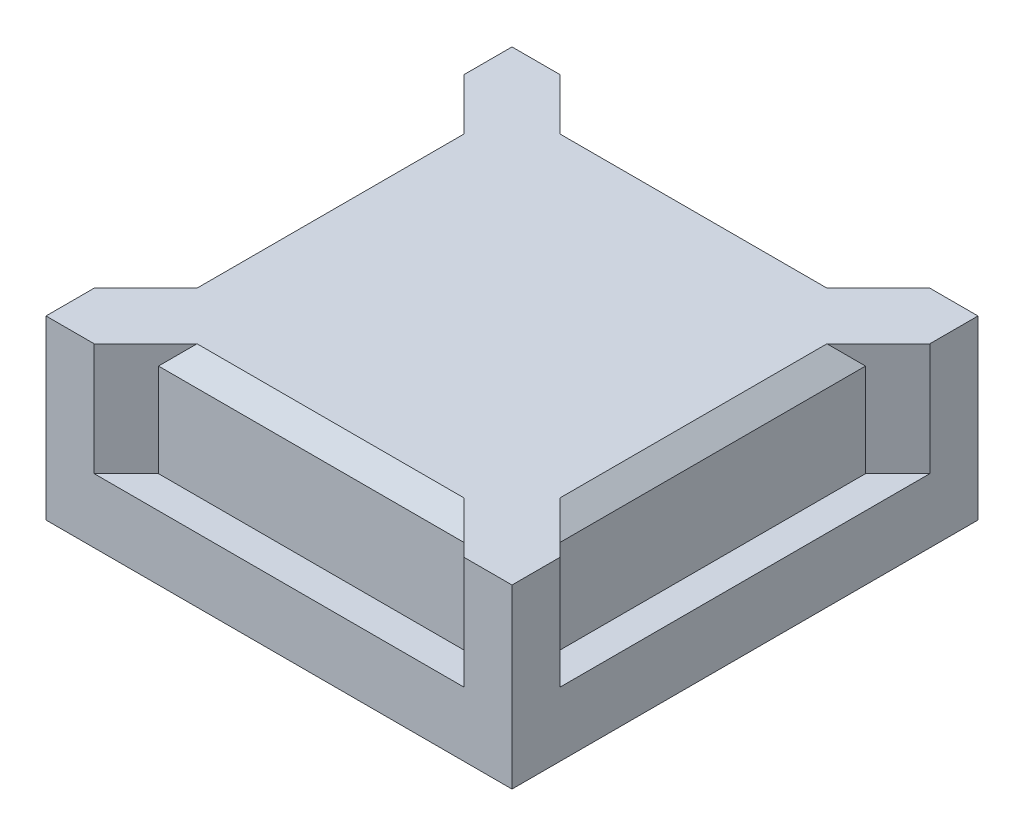
ISO-10303-21;
HEADER;
FILE_DESCRIPTION(('STEP AP214'),'2;1');
FILE_NAME('part.step','',(''),(''),'','','');
FILE_SCHEMA(('AUTOMOTIVE_DESIGN { 1 0 10303 214 1 1 1 1 }'));
ENDSEC;
DATA;
#1=APPLICATION_CONTEXT('core data for automotive mechanical design processes');
#2=APPLICATION_PROTOCOL_DEFINITION('international standard','automotive_design',2000,#1);
#3=PRODUCT_CONTEXT('',#1,'mechanical');
#4=PRODUCT('Part','Part','',(#3));
#5=PRODUCT_RELATED_PRODUCT_CATEGORY('part','',(#4));
#6=PRODUCT_DEFINITION_FORMATION('','',#4);
#7=PRODUCT_DEFINITION_CONTEXT('part definition',#1,'design');
#8=PRODUCT_DEFINITION('design','',#6,#7);
#9=PRODUCT_DEFINITION_SHAPE('','',#8);
#10=(LENGTH_UNIT() NAMED_UNIT(*) SI_UNIT(.MILLI.,.METRE.));
#11=(NAMED_UNIT(*) PLANE_ANGLE_UNIT() SI_UNIT($,.RADIAN.));
#12=(NAMED_UNIT(*) SI_UNIT($,.STERADIAN.) SOLID_ANGLE_UNIT());
#13=UNCERTAINTY_MEASURE_WITH_UNIT(LENGTH_MEASURE(1.E-05),#10,'distance_accuracy_value','');
#14=(GEOMETRIC_REPRESENTATION_CONTEXT(3) GLOBAL_UNCERTAINTY_ASSIGNED_CONTEXT((#13)) GLOBAL_UNIT_ASSIGNED_CONTEXT((#10,
#11,#12)) REPRESENTATION_CONTEXT('',''));
#15=CARTESIAN_POINT('',(0.,0.,0.));
#16=DIRECTION('',(0.,0.,1.));
#17=DIRECTION('',(1.,0.,0.));
#18=AXIS2_PLACEMENT_3D('',#15,#16,#17);
#19=CARTESIAN_POINT('',(-2.9,2.2,-2.9));
#20=DIRECTION('',(1.,0.,0.));
#21=DIRECTION('',(0.,0.,-1.));
#22=AXIS2_PLACEMENT_3D('',#19,#20,#21);
#23=PLANE('',#22);
#24=DIRECTION('',(0.,0.,1.));
#25=VECTOR('',#24,1.);
#26=CARTESIAN_POINT('',(-2.9,2.2,-2.9));
#27=LINE('',#26,#25);
#28=CARTESIAN_POINT('',(-2.9,2.2,2.3));
#29=VERTEX_POINT('',#28);
#30=CARTESIAN_POINT('',(-2.9,2.2,2.9));
#31=VERTEX_POINT('',#30);
#32=EDGE_CURVE('E245',#29,#31,#27,.T.);
#33=ORIENTED_EDGE('',*,*,#32,.F.);
#34=DIRECTION('',(0.,-1.,0.));
#35=VECTOR('',#34,1.);
#36=CARTESIAN_POINT('',(-2.9,2.2,2.3));
#37=LINE('',#36,#35);
#38=CARTESIAN_POINT('',(-2.9,0.8,2.3));
#39=VERTEX_POINT('',#38);
#40=EDGE_CURVE('E228',#29,#39,#37,.T.);
#41=ORIENTED_EDGE('',*,*,#40,.T.);
#42=DIRECTION('',(0.,0.,-1.));
#43=VECTOR('',#42,1.);
#44=CARTESIAN_POINT('',(-2.9,0.8,2.3));
#45=LINE('',#44,#43);
#46=CARTESIAN_POINT('',(-2.9,0.8,-2.3));
#47=VERTEX_POINT('',#46);
#48=EDGE_CURVE('E497',#39,#47,#45,.T.);
#49=ORIENTED_EDGE('',*,*,#48,.T.);
#50=DIRECTION('',(0.,-1.,0.));
#51=VECTOR('',#50,1.);
#52=CARTESIAN_POINT('',(-2.9,2.2,-2.3));
#53=LINE('',#52,#51);
#54=CARTESIAN_POINT('',(-2.9,2.2,-2.3));
#55=VERTEX_POINT('',#54);
#56=EDGE_CURVE('E238',#55,#47,#53,.T.);
#57=ORIENTED_EDGE('',*,*,#56,.F.);
#58=CARTESIAN_POINT('',(-2.9,2.2,-2.9));
#59=VERTEX_POINT('',#58);
#60=EDGE_CURVE('E255',#59,#55,#27,.T.);
#61=ORIENTED_EDGE('',*,*,#60,.F.);
#62=DIRECTION('',(0.,-1.,0.));
#63=VECTOR('',#62,1.);
#64=CARTESIAN_POINT('',(-2.9,2.2,-2.9));
#65=LINE('',#64,#63);
#66=CARTESIAN_POINT('',(-2.9,0.,-2.9));
#67=VERTEX_POINT('',#66);
#68=EDGE_CURVE('E276',#59,#67,#65,.T.);
#69=ORIENTED_EDGE('',*,*,#68,.T.);
#70=DIRECTION('',(0.,0.,1.));
#71=VECTOR('',#70,1.);
#72=CARTESIAN_POINT('',(-2.9,0.,-2.9));
#73=LINE('',#72,#71);
#74=CARTESIAN_POINT('',(-2.9,0.,2.9));
#75=VERTEX_POINT('',#74);
#76=EDGE_CURVE('E277',#67,#75,#73,.T.);
#77=ORIENTED_EDGE('',*,*,#76,.T.);
#78=DIRECTION('',(0.,-1.,0.));
#79=VECTOR('',#78,1.);
#80=CARTESIAN_POINT('',(-2.9,2.2,2.9));
#81=LINE('',#80,#79);
#82=EDGE_CURVE('E254',#31,#75,#81,.T.);
#83=ORIENTED_EDGE('',*,*,#82,.F.);
#84=EDGE_LOOP('',(#33,#41,#49,#57,#61,#69,#77,#83));
#85=FACE_BOUND('',#84,.T.);
#86=ADVANCED_FACE('F43',(#85),#23,.F.);
#87=CARTESIAN_POINT('',(2.9,2.2,2.9));
#88=DIRECTION('',(0.,0.,-1.));
#89=DIRECTION('',(-1.,0.,0.));
#90=AXIS2_PLACEMENT_3D('',#87,#88,#89);
#91=PLANE('',#90);
#92=DIRECTION('',(1.,0.,0.));
#93=VECTOR('',#92,1.);
#94=CARTESIAN_POINT('',(2.9,2.2,2.9));
#95=LINE('',#94,#93);
#96=CARTESIAN_POINT('',(2.30000000000001,2.2,2.89999999999999));
#97=VERTEX_POINT('',#96);
#98=CARTESIAN_POINT('',(2.9,2.2,2.9));
#99=VERTEX_POINT('',#98);
#100=EDGE_CURVE('E259',#97,#99,#95,.T.);
#101=ORIENTED_EDGE('',*,*,#100,.F.);
#102=DIRECTION('',(0.,-1.,0.));
#103=VECTOR('',#102,1.);
#104=CARTESIAN_POINT('',(2.30000000000001,2.2,2.89999999999999));
#105=LINE('',#104,#103);
#106=CARTESIAN_POINT('',(2.30000000000001,0.8,2.89999999999999));
#107=VERTEX_POINT('',#106);
#108=EDGE_CURVE('E506',#97,#107,#105,.T.);
#109=ORIENTED_EDGE('',*,*,#108,.T.);
#110=DIRECTION('',(-1.,0.,0.));
#111=VECTOR('',#110,1.);
#112=CARTESIAN_POINT('',(2.30000000000001,0.8,2.89999999999999));
#113=LINE('',#112,#111);
#114=CARTESIAN_POINT('',(-2.29999999999999,0.8,2.90000000000001));
#115=VERTEX_POINT('',#114);
#116=EDGE_CURVE('E523',#107,#115,#113,.T.);
#117=ORIENTED_EDGE('',*,*,#116,.T.);
#118=DIRECTION('',(0.,-1.,0.));
#119=VECTOR('',#118,1.);
#120=CARTESIAN_POINT('',(-2.29999999999999,2.2,2.90000000000001));
#121=LINE('',#120,#119);
#122=CARTESIAN_POINT('',(-2.29999999999999,2.2,2.90000000000001));
#123=VERTEX_POINT('',#122);
#124=EDGE_CURVE('E510',#123,#115,#121,.T.);
#125=ORIENTED_EDGE('',*,*,#124,.F.);
#126=EDGE_CURVE('E266',#31,#123,#95,.T.);
#127=ORIENTED_EDGE('',*,*,#126,.F.);
#128=ORIENTED_EDGE('',*,*,#82,.T.);
#129=DIRECTION('',(1.,0.,0.));
#130=VECTOR('',#129,1.);
#131=CARTESIAN_POINT('',(2.9,0.,2.9));
#132=LINE('',#131,#130);
#133=CARTESIAN_POINT('',(2.9,0.,2.9));
#134=VERTEX_POINT('',#133);
#135=EDGE_CURVE('E279',#75,#134,#132,.T.);
#136=ORIENTED_EDGE('',*,*,#135,.T.);
#137=DIRECTION('',(0.,-1.,0.));
#138=VECTOR('',#137,1.);
#139=CARTESIAN_POINT('',(2.9,2.2,2.9));
#140=LINE('',#139,#138);
#141=EDGE_CURVE('E288',#99,#134,#140,.T.);
#142=ORIENTED_EDGE('',*,*,#141,.F.);
#143=EDGE_LOOP('',(#101,#109,#117,#125,#127,#128,#136,#142));
#144=FACE_BOUND('',#143,.T.);
#145=ADVANCED_FACE('F438',(#144),#91,.F.);
#146=CARTESIAN_POINT('',(2.9,2.2,-2.9));
#147=DIRECTION('',(-1.,0.,0.));
#148=DIRECTION('',(0.,0.,1.));
#149=AXIS2_PLACEMENT_3D('',#146,#147,#148);
#150=PLANE('',#149);
#151=DIRECTION('',(0.,0.,-1.));
#152=VECTOR('',#151,1.);
#153=CARTESIAN_POINT('',(2.9,2.2,-2.9));
#154=LINE('',#153,#152);
#155=CARTESIAN_POINT('',(2.89999999999998,2.2,-2.30000000000002));
#156=VERTEX_POINT('',#155);
#157=CARTESIAN_POINT('',(2.9,2.2,-2.9));
#158=VERTEX_POINT('',#157);
#159=EDGE_CURVE('E268',#156,#158,#154,.T.);
#160=ORIENTED_EDGE('',*,*,#159,.F.);
#161=DIRECTION('',(0.,-1.,0.));
#162=VECTOR('',#161,1.);
#163=CARTESIAN_POINT('',(2.89999999999998,2.2,-2.30000000000002));
#164=LINE('',#163,#162);
#165=CARTESIAN_POINT('',(2.89999999999998,0.8,-2.30000000000002));
#166=VERTEX_POINT('',#165);
#167=EDGE_CURVE('E340',#156,#166,#164,.T.);
#168=ORIENTED_EDGE('',*,*,#167,.T.);
#169=DIRECTION('',(0.,0.,1.));
#170=VECTOR('',#169,1.);
#171=CARTESIAN_POINT('',(2.89999999999998,0.8,-2.30000000000002));
#172=LINE('',#171,#170);
#173=CARTESIAN_POINT('',(2.90000000000002,0.8,2.29999999999998));
#174=VERTEX_POINT('',#173);
#175=EDGE_CURVE('E538',#166,#174,#172,.T.);
#176=ORIENTED_EDGE('',*,*,#175,.T.);
#177=DIRECTION('',(0.,-1.,0.));
#178=VECTOR('',#177,1.);
#179=CARTESIAN_POINT('',(2.90000000000002,2.2,2.29999999999998));
#180=LINE('',#179,#178);
#181=CARTESIAN_POINT('',(2.90000000000002,2.2,2.29999999999998));
#182=VERTEX_POINT('',#181);
#183=EDGE_CURVE('E345',#182,#174,#180,.T.);
#184=ORIENTED_EDGE('',*,*,#183,.F.);
#185=EDGE_CURVE('E269',#99,#182,#154,.T.);
#186=ORIENTED_EDGE('',*,*,#185,.F.);
#187=ORIENTED_EDGE('',*,*,#141,.T.);
#188=DIRECTION('',(0.,0.,-1.));
#189=VECTOR('',#188,1.);
#190=CARTESIAN_POINT('',(2.9,0.,-2.9));
#191=LINE('',#190,#189);
#192=CARTESIAN_POINT('',(2.9,0.,-2.9));
#193=VERTEX_POINT('',#192);
#194=EDGE_CURVE('E260',#134,#193,#191,.T.);
#195=ORIENTED_EDGE('',*,*,#194,.T.);
#196=DIRECTION('',(0.,-1.,0.));
#197=VECTOR('',#196,1.);
#198=CARTESIAN_POINT('',(2.9,2.2,-2.9));
#199=LINE('',#198,#197);
#200=EDGE_CURVE('E285',#158,#193,#199,.T.);
#201=ORIENTED_EDGE('',*,*,#200,.F.);
#202=EDGE_LOOP('',(#160,#168,#176,#184,#186,#187,#195,#201));
#203=FACE_BOUND('',#202,.T.);
#204=ADVANCED_FACE('F444',(#203),#150,.F.);
#205=CARTESIAN_POINT('',(2.9,2.2,-2.9));
#206=DIRECTION('',(0.,0.,1.));
#207=DIRECTION('',(1.,0.,0.));
#208=AXIS2_PLACEMENT_3D('',#205,#206,#207);
#209=PLANE('',#208);
#210=DIRECTION('',(-1.,0.,0.));
#211=VECTOR('',#210,1.);
#212=CARTESIAN_POINT('',(2.9,2.2,-2.9));
#213=LINE('',#212,#211);
#214=CARTESIAN_POINT('',(-2.30000000000003,2.2,-2.89999999999998));
#215=VERTEX_POINT('',#214);
#216=EDGE_CURVE('E272',#215,#59,#213,.T.);
#217=ORIENTED_EDGE('',*,*,#216,.F.);
#218=DIRECTION('',(0.,-1.,0.));
#219=VECTOR('',#218,1.);
#220=CARTESIAN_POINT('',(-2.30000000000003,2.2,-2.89999999999998));
#221=LINE('',#220,#219);
#222=CARTESIAN_POINT('',(-2.30000000000003,0.8,-2.89999999999998));
#223=VERTEX_POINT('',#222);
#224=EDGE_CURVE('E351',#215,#223,#221,.T.);
#225=ORIENTED_EDGE('',*,*,#224,.T.);
#226=DIRECTION('',(1.,0.,0.));
#227=VECTOR('',#226,1.);
#228=CARTESIAN_POINT('',(-2.30000000000003,0.8,-2.89999999999998));
#229=LINE('',#228,#227);
#230=CARTESIAN_POINT('',(2.29999999999997,0.8,-2.90000000000002));
#231=VERTEX_POINT('',#230);
#232=EDGE_CURVE('E368',#223,#231,#229,.T.);
#233=ORIENTED_EDGE('',*,*,#232,.T.);
#234=DIRECTION('',(0.,-1.,0.));
#235=VECTOR('',#234,1.);
#236=CARTESIAN_POINT('',(2.29999999999997,2.2,-2.90000000000002));
#237=LINE('',#236,#235);
#238=CARTESIAN_POINT('',(2.29999999999997,2.2,-2.90000000000002));
#239=VERTEX_POINT('',#238);
#240=EDGE_CURVE('E355',#239,#231,#237,.T.);
#241=ORIENTED_EDGE('',*,*,#240,.F.);
#242=EDGE_CURVE('E273',#158,#239,#213,.T.);
#243=ORIENTED_EDGE('',*,*,#242,.F.);
#244=ORIENTED_EDGE('',*,*,#200,.T.);
#245=DIRECTION('',(-1.,0.,0.));
#246=VECTOR('',#245,1.);
#247=CARTESIAN_POINT('',(2.9,0.,-2.9));
#248=LINE('',#247,#246);
#249=EDGE_CURVE('E256',#193,#67,#248,.T.);
#250=ORIENTED_EDGE('',*,*,#249,.T.);
#251=ORIENTED_EDGE('',*,*,#68,.F.);
#252=EDGE_LOOP('',(#217,#225,#233,#241,#243,#244,#250,#251));
#253=FACE_BOUND('',#252,.T.);
#254=ADVANCED_FACE('F487',(#253),#209,.F.);
#255=CARTESIAN_POINT('',(0.,2.2,0.));
#256=DIRECTION('',(0.,-1.,0.));
#257=DIRECTION('',(0.,0.,-1.));
#258=AXIS2_PLACEMENT_3D('',#255,#256,#257);
#259=PLANE('',#258);
#260=DIRECTION('',(0.,0.,1.));
#261=VECTOR('',#260,1.);
#262=CARTESIAN_POINT('',(-2.26,2.2,0.));
#263=LINE('',#262,#261);
#264=CARTESIAN_POINT('',(-2.26,2.2,-1.66));
#265=VERTEX_POINT('',#264);
#266=CARTESIAN_POINT('',(-2.26,2.2,1.66000000000002));
#267=VERTEX_POINT('',#266);
#268=EDGE_CURVE('E248',#265,#267,#263,.T.);
#269=ORIENTED_EDGE('',*,*,#268,.T.);
#270=DIRECTION('',(-0.707106781186558,0.,0.707106781186537));
#271=VECTOR('',#270,1.);
#272=CARTESIAN_POINT('',(-2.9,2.2,2.3));
#273=LINE('',#272,#271);
#274=EDGE_CURVE('E231',#267,#29,#273,.T.);
#275=ORIENTED_EDGE('',*,*,#274,.T.);
#276=ORIENTED_EDGE('',*,*,#32,.T.);
#277=ORIENTED_EDGE('',*,*,#126,.T.);
#278=DIRECTION('',(0.707106781186542,0.,-0.707106781186553));
#279=VECTOR('',#278,1.);
#280=CARTESIAN_POINT('',(-1.89999999999999,2.2,2.50000000000001));
#281=LINE('',#280,#279);
#282=CARTESIAN_POINT('',(-1.66,2.2,2.26000000000001));
#283=VERTEX_POINT('',#282);
#284=EDGE_CURVE('E509',#123,#283,#281,.T.);
#285=ORIENTED_EDGE('',*,*,#284,.T.);
#286=DIRECTION('',(1.,0.,0.));
#287=VECTOR('',#286,1.);
#288=CARTESIAN_POINT('',(0.,2.2,2.26));
#289=LINE('',#288,#287);
#290=CARTESIAN_POINT('',(1.66000000000003,2.2,2.26));
#291=VERTEX_POINT('',#290);
#292=EDGE_CURVE('E298',#283,#291,#289,.T.);
#293=ORIENTED_EDGE('',*,*,#292,.T.);
#294=DIRECTION('',(0.70710678118654,0.,0.707106781186555));
#295=VECTOR('',#294,1.);
#296=CARTESIAN_POINT('',(2.30000000000001,2.2,2.89999999999999));
#297=LINE('',#296,#295);
#298=EDGE_CURVE('E520',#291,#97,#297,.T.);
#299=ORIENTED_EDGE('',*,*,#298,.T.);
#300=ORIENTED_EDGE('',*,*,#100,.T.);
#301=ORIENTED_EDGE('',*,*,#185,.T.);
#302=DIRECTION('',(-0.707106781186555,0.,-0.70710678118654));
#303=VECTOR('',#302,1.);
#304=CARTESIAN_POINT('',(2.50000000000001,2.2,1.89999999999999));
#305=LINE('',#304,#303);
#306=CARTESIAN_POINT('',(2.26000000000001,2.2,1.65999999999999));
#307=VERTEX_POINT('',#306);
#308=EDGE_CURVE('E329',#182,#307,#305,.T.);
#309=ORIENTED_EDGE('',*,*,#308,.T.);
#310=DIRECTION('',(0.,0.,-1.));
#311=VECTOR('',#310,1.);
#312=CARTESIAN_POINT('',(2.26,2.2,0.));
#313=LINE('',#312,#311);
#314=CARTESIAN_POINT('',(2.25999999999999,2.2,-1.66000000000003));
#315=VERTEX_POINT('',#314);
#316=EDGE_CURVE('E295',#307,#315,#313,.T.);
#317=ORIENTED_EDGE('',*,*,#316,.T.);
#318=DIRECTION('',(0.707106781186553,0.,-0.707106781186542));
#319=VECTOR('',#318,1.);
#320=CARTESIAN_POINT('',(2.89999999999998,2.2,-2.30000000000002));
#321=LINE('',#320,#319);
#322=EDGE_CURVE('E337',#315,#156,#321,.T.);
#323=ORIENTED_EDGE('',*,*,#322,.T.);
#324=ORIENTED_EDGE('',*,*,#159,.T.);
#325=ORIENTED_EDGE('',*,*,#242,.T.);
#326=DIRECTION('',(-0.707106781186538,0.,0.707106781186557));
#327=VECTOR('',#326,1.);
#328=CARTESIAN_POINT('',(1.89999999999998,2.2,-2.50000000000002));
#329=LINE('',#328,#327);
#330=CARTESIAN_POINT('',(1.65999999999998,2.2,-2.26000000000002));
#331=VERTEX_POINT('',#330);
#332=EDGE_CURVE('E354',#239,#331,#329,.T.);
#333=ORIENTED_EDGE('',*,*,#332,.T.);
#334=DIRECTION('',(-1.,0.,0.));
#335=VECTOR('',#334,1.);
#336=CARTESIAN_POINT('',(0.,2.2,-2.26));
#337=LINE('',#336,#335);
#338=CARTESIAN_POINT('',(-1.66000000000004,2.2,-2.25999999999998));
#339=VERTEX_POINT('',#338);
#340=EDGE_CURVE('E292',#331,#339,#337,.T.);
#341=ORIENTED_EDGE('',*,*,#340,.T.);
#342=DIRECTION('',(-0.707106781186544,0.,-0.707106781186551));
#343=VECTOR('',#342,1.);
#344=CARTESIAN_POINT('',(-2.30000000000003,2.2,-2.89999999999998));
#345=LINE('',#344,#343);
#346=EDGE_CURVE('E365',#339,#215,#345,.T.);
#347=ORIENTED_EDGE('',*,*,#346,.T.);
#348=ORIENTED_EDGE('',*,*,#216,.T.);
#349=ORIENTED_EDGE('',*,*,#60,.T.);
#350=DIRECTION('',(0.70710678118655,0.,0.707106781186545));
#351=VECTOR('',#350,1.);
#352=CARTESIAN_POINT('',(-2.5,2.2,-1.9));
#353=LINE('',#352,#351);
#354=EDGE_CURVE('E239',#55,#265,#353,.T.);
#355=ORIENTED_EDGE('',*,*,#354,.T.);
#356=EDGE_LOOP('',(#269,#275,#276,#277,#285,#293,#299,#300,#301,#309,#317,#323,#324,#325,#333,
#341,#347,#348,#349,#355));
#357=FACE_BOUND('',#356,.T.);
#358=ADVANCED_FACE('F243',(#357),#259,.F.);
#359=CARTESIAN_POINT('',(0.,0.,0.));
#360=DIRECTION('',(0.,-1.,0.));
#361=DIRECTION('',(0.,0.,-1.));
#362=AXIS2_PLACEMENT_3D('',#359,#360,#361);
#363=PLANE('',#362);
#364=DIRECTION('',(0.,0.,-1.));
#365=VECTOR('',#364,1.);
#366=CARTESIAN_POINT('',(-1.85,0.,1.5));
#367=LINE('',#366,#365);
#368=CARTESIAN_POINT('',(-1.85,0.,1.5));
#369=VERTEX_POINT('',#368);
#370=CARTESIAN_POINT('',(-1.85,0.,-1.5));
#371=VERTEX_POINT('',#370);
#372=EDGE_CURVE('E391',#369,#371,#367,.T.);
#373=ORIENTED_EDGE('',*,*,#372,.F.);
#374=DIRECTION('',(-1.,0.,0.));
#375=VECTOR('',#374,1.);
#376=CARTESIAN_POINT('',(1.85,0.,1.5));
#377=LINE('',#376,#375);
#378=CARTESIAN_POINT('',(1.85,0.,1.5));
#379=VERTEX_POINT('',#378);
#380=EDGE_CURVE('E382',#379,#369,#377,.T.);
#381=ORIENTED_EDGE('',*,*,#380,.F.);
#382=DIRECTION('',(0.,0.,1.));
#383=VECTOR('',#382,1.);
#384=CARTESIAN_POINT('',(1.85,0.,1.5));
#385=LINE('',#384,#383);
#386=CARTESIAN_POINT('',(1.85,0.,-1.5));
#387=VERTEX_POINT('',#386);
#388=EDGE_CURVE('E397',#387,#379,#385,.T.);
#389=ORIENTED_EDGE('',*,*,#388,.F.);
#390=DIRECTION('',(1.,0.,0.));
#391=VECTOR('',#390,1.);
#392=CARTESIAN_POINT('',(1.85,0.,-1.5));
#393=LINE('',#392,#391);
#394=EDGE_CURVE('E393',#371,#387,#393,.T.);
#395=ORIENTED_EDGE('',*,*,#394,.F.);
#396=EDGE_LOOP('',(#373,#381,#389,#395));
#397=FACE_BOUND('',#396,.T.);
#398=ORIENTED_EDGE('',*,*,#76,.F.);
#399=ORIENTED_EDGE('',*,*,#249,.F.);
#400=ORIENTED_EDGE('',*,*,#194,.F.);
#401=ORIENTED_EDGE('',*,*,#135,.F.);
#402=EDGE_LOOP('',(#398,#399,#400,#401));
#403=FACE_BOUND('',#402,.T.);
#404=ADVANCED_FACE('F417',(#397,#403),#363,.T.);
#405=CARTESIAN_POINT('',(-1.85,1.75,1.5));
#406=DIRECTION('',(-1.,0.,0.));
#407=DIRECTION('',(0.,0.,1.));
#408=AXIS2_PLACEMENT_3D('',#405,#406,#407);
#409=PLANE('',#408);
#410=ORIENTED_EDGE('',*,*,#372,.T.);
#411=DIRECTION('',(0.,-1.,0.));
#412=VECTOR('',#411,1.);
#413=CARTESIAN_POINT('',(-1.85,1.75,-1.5));
#414=LINE('',#413,#412);
#415=CARTESIAN_POINT('',(-1.85,1.75,-1.5));
#416=VERTEX_POINT('',#415);
#417=EDGE_CURVE('E264',#416,#371,#414,.T.);
#418=ORIENTED_EDGE('',*,*,#417,.F.);
#419=DIRECTION('',(0.,0.,-1.));
#420=VECTOR('',#419,1.);
#421=CARTESIAN_POINT('',(-1.85,1.75,1.5));
#422=LINE('',#421,#420);
#423=CARTESIAN_POINT('',(-1.85,1.75,1.5));
#424=VERTEX_POINT('',#423);
#425=EDGE_CURVE('E378',#424,#416,#422,.T.);
#426=ORIENTED_EDGE('',*,*,#425,.F.);
#427=DIRECTION('',(0.,-1.,0.));
#428=VECTOR('',#427,1.);
#429=CARTESIAN_POINT('',(-1.85,1.75,1.5));
#430=LINE('',#429,#428);
#431=EDGE_CURVE('E280',#424,#369,#430,.T.);
#432=ORIENTED_EDGE('',*,*,#431,.T.);
#433=EDGE_LOOP('',(#410,#418,#426,#432));
#434=FACE_BOUND('',#433,.T.);
#435=ADVANCED_FACE('F426',(#434),#409,.F.);
#436=CARTESIAN_POINT('',(1.85,1.75,1.5));
#437=DIRECTION('',(0.,0.,1.));
#438=DIRECTION('',(1.,0.,0.));
#439=AXIS2_PLACEMENT_3D('',#436,#437,#438);
#440=PLANE('',#439);
#441=ORIENTED_EDGE('',*,*,#380,.T.);
#442=ORIENTED_EDGE('',*,*,#431,.F.);
#443=DIRECTION('',(-1.,0.,0.));
#444=VECTOR('',#443,1.);
#445=CARTESIAN_POINT('',(1.85,1.75,1.5));
#446=LINE('',#445,#444);
#447=CARTESIAN_POINT('',(1.85,1.75,1.5));
#448=VERTEX_POINT('',#447);
#449=EDGE_CURVE('E388',#448,#424,#446,.T.);
#450=ORIENTED_EDGE('',*,*,#449,.F.);
#451=DIRECTION('',(0.,-1.,0.));
#452=VECTOR('',#451,1.);
#453=CARTESIAN_POINT('',(1.85,1.75,1.5));
#454=LINE('',#453,#452);
#455=EDGE_CURVE('E403',#448,#379,#454,.T.);
#456=ORIENTED_EDGE('',*,*,#455,.T.);
#457=EDGE_LOOP('',(#441,#442,#450,#456));
#458=FACE_BOUND('',#457,.T.);
#459=ADVANCED_FACE('F425',(#458),#440,.F.);
#460=CARTESIAN_POINT('',(1.85,1.75,1.5));
#461=DIRECTION('',(1.,0.,0.));
#462=DIRECTION('',(0.,0.,-1.));
#463=AXIS2_PLACEMENT_3D('',#460,#461,#462);
#464=PLANE('',#463);
#465=ORIENTED_EDGE('',*,*,#388,.T.);
#466=ORIENTED_EDGE('',*,*,#455,.F.);
#467=DIRECTION('',(0.,0.,1.));
#468=VECTOR('',#467,1.);
#469=CARTESIAN_POINT('',(1.85,1.75,1.5));
#470=LINE('',#469,#468);
#471=CARTESIAN_POINT('',(1.85,1.75,-1.5));
#472=VERTEX_POINT('',#471);
#473=EDGE_CURVE('E385',#472,#448,#470,.T.);
#474=ORIENTED_EDGE('',*,*,#473,.F.);
#475=DIRECTION('',(0.,-1.,0.));
#476=VECTOR('',#475,1.);
#477=CARTESIAN_POINT('',(1.85,1.75,-1.5));
#478=LINE('',#477,#476);
#479=EDGE_CURVE('E404',#472,#387,#478,.T.);
#480=ORIENTED_EDGE('',*,*,#479,.T.);
#481=EDGE_LOOP('',(#465,#466,#474,#480));
#482=FACE_BOUND('',#481,.T.);
#483=ADVANCED_FACE('F420',(#482),#464,.F.);
#484=CARTESIAN_POINT('',(1.85,1.75,-1.5));
#485=DIRECTION('',(0.,0.,-1.));
#486=DIRECTION('',(-1.,0.,0.));
#487=AXIS2_PLACEMENT_3D('',#484,#485,#486);
#488=PLANE('',#487);
#489=ORIENTED_EDGE('',*,*,#394,.T.);
#490=ORIENTED_EDGE('',*,*,#479,.F.);
#491=DIRECTION('',(1.,0.,0.));
#492=VECTOR('',#491,1.);
#493=CARTESIAN_POINT('',(1.85,1.75,-1.5));
#494=LINE('',#493,#492);
#495=EDGE_CURVE('E381',#416,#472,#494,.T.);
#496=ORIENTED_EDGE('',*,*,#495,.F.);
#497=ORIENTED_EDGE('',*,*,#417,.T.);
#498=EDGE_LOOP('',(#489,#490,#496,#497));
#499=FACE_BOUND('',#498,.T.);
#500=ADVANCED_FACE('F411',(#499),#488,.F.);
#501=CARTESIAN_POINT('',(0.,1.75,0.));
#502=DIRECTION('',(0.,1.,0.));
#503=DIRECTION('',(0.,0.,1.));
#504=AXIS2_PLACEMENT_3D('',#501,#502,#503);
#505=PLANE('',#504);
#506=ORIENTED_EDGE('',*,*,#425,.T.);
#507=ORIENTED_EDGE('',*,*,#495,.T.);
#508=ORIENTED_EDGE('',*,*,#473,.T.);
#509=ORIENTED_EDGE('',*,*,#449,.T.);
#510=EDGE_LOOP('',(#506,#507,#508,#509));
#511=FACE_BOUND('',#510,.T.);
#512=ADVANCED_FACE('F424',(#511),#505,.F.);
#513=CARTESIAN_POINT('',(-2.30000000000003,2.2,-2.89999999999998));
#514=DIRECTION('',(-0.707106781186551,0.,0.707106781186545));
#515=DIRECTION('',(0.707106781186545,0.,0.707106781186551));
#516=AXIS2_PLACEMENT_3D('',#513,#514,#515);
#517=PLANE('',#516);
#518=DIRECTION('',(-0.707106781186544,0.,-0.707106781186551));
#519=VECTOR('',#518,1.);
#520=CARTESIAN_POINT('',(-2.30000000000003,0.8,-2.89999999999998));
#521=LINE('',#520,#519);
#522=CARTESIAN_POINT('',(-1.90000000000004,0.8,-2.49999999999998));
#523=VERTEX_POINT('',#522);
#524=EDGE_CURVE('E371',#523,#223,#521,.T.);
#525=ORIENTED_EDGE('',*,*,#524,.T.);
#526=ORIENTED_EDGE('',*,*,#224,.F.);
#527=ORIENTED_EDGE('',*,*,#346,.F.);
#528=DIRECTION('',(0.577350269189619,0.577350269189634,0.577350269189624));
#529=VECTOR('',#528,1.);
#530=CARTESIAN_POINT('',(-2.08666666666669,1.77333333333334,-2.68666666666664));
#531=LINE('',#530,#529);
#532=CARTESIAN_POINT('',(-1.90000000000004,1.96,-2.49999999999998));
#533=VERTEX_POINT('',#532);
#534=EDGE_CURVE('E52',#339,#533,#531,.F.);
#535=ORIENTED_EDGE('',*,*,#534,.T.);
#536=DIRECTION('',(0.,-1.,0.));
#537=VECTOR('',#536,1.);
#538=CARTESIAN_POINT('',(-1.90000000000004,2.2,-2.49999999999998));
#539=LINE('',#538,#537);
#540=EDGE_CURVE('E359',#533,#523,#539,.T.);
#541=ORIENTED_EDGE('',*,*,#540,.T.);
#542=EDGE_LOOP('',(#525,#526,#527,#535,#541));
#543=FACE_BOUND('',#542,.T.);
#544=ADVANCED_FACE('F484',(#543),#517,.F.);
#545=CARTESIAN_POINT('',(-1.90000000000004,2.2,-2.49999999999998));
#546=DIRECTION('',(0.,0.,1.));
#547=DIRECTION('',(1.,0.,0.));
#548=AXIS2_PLACEMENT_3D('',#545,#546,#547);
#549=PLANE('',#548);
#550=ORIENTED_EDGE('',*,*,#540,.F.);
#551=DIRECTION('',(1.,0.,0.));
#552=VECTOR('',#551,1.);
#553=CARTESIAN_POINT('',(-1.90000000000004,1.96,-2.49999999999998));
#554=LINE('',#553,#552);
#555=CARTESIAN_POINT('',(1.89999999999998,1.96,-2.50000000000002));
#556=VERTEX_POINT('',#555);
#557=EDGE_CURVE('E59',#533,#556,#554,.T.);
#558=ORIENTED_EDGE('',*,*,#557,.T.);
#559=DIRECTION('',(0.,-1.,0.));
#560=VECTOR('',#559,1.);
#561=CARTESIAN_POINT('',(1.89999999999998,2.2,-2.50000000000002));
#562=LINE('',#561,#560);
#563=CARTESIAN_POINT('',(1.89999999999998,0.8,-2.50000000000002));
#564=VERTEX_POINT('',#563);
#565=EDGE_CURVE('E357',#556,#564,#562,.T.);
#566=ORIENTED_EDGE('',*,*,#565,.T.);
#567=DIRECTION('',(-1.,0.,0.));
#568=VECTOR('',#567,1.);
#569=CARTESIAN_POINT('',(-1.90000000000004,0.8,-2.49999999999998));
#570=LINE('',#569,#568);
#571=EDGE_CURVE('E361',#564,#523,#570,.T.);
#572=ORIENTED_EDGE('',*,*,#571,.T.);
#573=EDGE_LOOP('',(#550,#558,#566,#572));
#574=FACE_BOUND('',#573,.T.);
#575=ADVANCED_FACE('F480',(#574),#549,.F.);
#576=CARTESIAN_POINT('',(1.89999999999998,2.2,-2.50000000000002));
#577=DIRECTION('',(0.707106781186558,0.,0.707106781186538));
#578=DIRECTION('',(0.707106781186538,0.,-0.707106781186558));
#579=AXIS2_PLACEMENT_3D('',#576,#577,#578);
#580=PLANE('',#579);
#581=DIRECTION('',(-0.707106781186538,0.,0.707106781186557));
#582=VECTOR('',#581,1.);
#583=CARTESIAN_POINT('',(1.89999999999998,0.8,-2.50000000000002));
#584=LINE('',#583,#582);
#585=EDGE_CURVE('E364',#231,#564,#584,.T.);
#586=ORIENTED_EDGE('',*,*,#585,.T.);
#587=ORIENTED_EDGE('',*,*,#565,.F.);
#588=DIRECTION('',(0.577350269189616,-0.57735026918963,-0.577350269189632));
#589=VECTOR('',#588,1.);
#590=CARTESIAN_POINT('',(1.81999999999998,2.04,-2.42000000000002));
#591=LINE('',#590,#589);
#592=EDGE_CURVE('E11',#556,#331,#591,.F.);
#593=ORIENTED_EDGE('',*,*,#592,.T.);
#594=ORIENTED_EDGE('',*,*,#332,.F.);
#595=ORIENTED_EDGE('',*,*,#240,.T.);
#596=EDGE_LOOP('',(#586,#587,#593,#594,#595));
#597=FACE_BOUND('',#596,.T.);
#598=ADVANCED_FACE('F476',(#597),#580,.F.);
#599=CARTESIAN_POINT('',(0.,0.8,0.));
#600=DIRECTION('',(0.,1.,0.));
#601=DIRECTION('',(0.,0.,1.));
#602=AXIS2_PLACEMENT_3D('',#599,#600,#601);
#603=PLANE('',#602);
#604=ORIENTED_EDGE('',*,*,#524,.F.);
#605=ORIENTED_EDGE('',*,*,#571,.F.);
#606=ORIENTED_EDGE('',*,*,#585,.F.);
#607=ORIENTED_EDGE('',*,*,#232,.F.);
#608=EDGE_LOOP('',(#604,#605,#606,#607));
#609=FACE_BOUND('',#608,.T.);
#610=ADVANCED_FACE('F483',(#609),#603,.T.);
#611=CARTESIAN_POINT('',(2.89999999999998,2.2,-2.30000000000002));
#612=DIRECTION('',(-0.707106781186542,0.,-0.707106781186553));
#613=DIRECTION('',(-0.707106781186553,0.,0.707106781186542));
#614=AXIS2_PLACEMENT_3D('',#611,#612,#613);
#615=PLANE('',#614);
#616=DIRECTION('',(0.707106781186553,0.,-0.707106781186542));
#617=VECTOR('',#616,1.);
#618=CARTESIAN_POINT('',(2.89999999999998,0.8,-2.30000000000002));
#619=LINE('',#618,#617);
#620=CARTESIAN_POINT('',(2.49999999999999,0.8,-1.90000000000003));
#621=VERTEX_POINT('',#620);
#622=EDGE_CURVE('E348',#621,#166,#619,.T.);
#623=ORIENTED_EDGE('',*,*,#622,.T.);
#624=ORIENTED_EDGE('',*,*,#167,.F.);
#625=ORIENTED_EDGE('',*,*,#322,.F.);
#626=DIRECTION('',(-0.577350269189626,0.577350269189635,0.577350269189617));
#627=VECTOR('',#626,1.);
#628=CARTESIAN_POINT('',(2.68666666666664,1.77333333333334,-2.08666666666668));
#629=LINE('',#628,#627);
#630=CARTESIAN_POINT('',(2.49999999999999,1.96,-1.90000000000003));
#631=VERTEX_POINT('',#630);
#632=EDGE_CURVE('E319',#315,#631,#629,.F.);
#633=ORIENTED_EDGE('',*,*,#632,.T.);
#634=DIRECTION('',(0.,-1.,0.));
#635=VECTOR('',#634,1.);
#636=CARTESIAN_POINT('',(2.49999999999999,2.2,-1.90000000000003));
#637=LINE('',#636,#635);
#638=EDGE_CURVE('E374',#631,#621,#637,.T.);
#639=ORIENTED_EDGE('',*,*,#638,.T.);
#640=EDGE_LOOP('',(#623,#624,#625,#633,#639));
#641=FACE_BOUND('',#640,.T.);
#642=ADVANCED_FACE('F543',(#641),#615,.F.);
#643=CARTESIAN_POINT('',(2.49999999999999,2.2,-1.90000000000003));
#644=DIRECTION('',(-1.,0.,0.));
#645=DIRECTION('',(0.,0.,1.));
#646=AXIS2_PLACEMENT_3D('',#643,#644,#645);
#647=PLANE('',#646);
#648=ORIENTED_EDGE('',*,*,#638,.F.);
#649=DIRECTION('',(0.,0.,1.));
#650=VECTOR('',#649,1.);
#651=CARTESIAN_POINT('',(2.49999999999999,1.96,-1.90000000000003));
#652=LINE('',#651,#650);
#653=CARTESIAN_POINT('',(2.50000000000001,1.96,1.89999999999999));
#654=VERTEX_POINT('',#653);
#655=EDGE_CURVE('E306',#631,#654,#652,.T.);
#656=ORIENTED_EDGE('',*,*,#655,.T.);
#657=DIRECTION('',(0.,-1.,0.));
#658=VECTOR('',#657,1.);
#659=CARTESIAN_POINT('',(2.50000000000001,2.2,1.89999999999999));
#660=LINE('',#659,#658);
#661=CARTESIAN_POINT('',(2.50000000000001,0.8,1.89999999999999));
#662=VERTEX_POINT('',#661);
#663=EDGE_CURVE('E331',#654,#662,#660,.T.);
#664=ORIENTED_EDGE('',*,*,#663,.T.);
#665=DIRECTION('',(0.,0.,-1.));
#666=VECTOR('',#665,1.);
#667=CARTESIAN_POINT('',(2.49999999999999,0.8,-1.90000000000003));
#668=LINE('',#667,#666);
#669=EDGE_CURVE('E342',#662,#621,#668,.T.);
#670=ORIENTED_EDGE('',*,*,#669,.T.);
#671=EDGE_LOOP('',(#648,#656,#664,#670));
#672=FACE_BOUND('',#671,.T.);
#673=ADVANCED_FACE('F591',(#672),#647,.F.);
#674=CARTESIAN_POINT('',(2.50000000000001,2.2,1.89999999999999));
#675=DIRECTION('',(-0.70710678118654,0.,0.707106781186555));
#676=DIRECTION('',(0.707106781186555,0.,0.70710678118654));
#677=AXIS2_PLACEMENT_3D('',#674,#675,#676);
#678=PLANE('',#677);
#679=DIRECTION('',(-0.707106781186555,0.,-0.70710678118654));
#680=VECTOR('',#679,1.);
#681=CARTESIAN_POINT('',(2.50000000000001,0.8,1.89999999999999));
#682=LINE('',#681,#680);
#683=EDGE_CURVE('E537',#174,#662,#682,.T.);
#684=ORIENTED_EDGE('',*,*,#683,.T.);
#685=ORIENTED_EDGE('',*,*,#663,.F.);
#686=DIRECTION('',(0.57735026918963,-0.57735026918963,0.577350269189618));
#687=VECTOR('',#686,1.);
#688=CARTESIAN_POINT('',(2.42000000000001,2.04,1.81999999999998));
#689=LINE('',#688,#687);
#690=EDGE_CURVE('E321',#654,#307,#689,.F.);
#691=ORIENTED_EDGE('',*,*,#690,.T.);
#692=ORIENTED_EDGE('',*,*,#308,.F.);
#693=ORIENTED_EDGE('',*,*,#183,.T.);
#694=EDGE_LOOP('',(#684,#685,#691,#692,#693));
#695=FACE_BOUND('',#694,.T.);
#696=ADVANCED_FACE('F328',(#695),#678,.F.);
#697=CARTESIAN_POINT('',(0.,0.8,0.));
#698=DIRECTION('',(0.,1.,0.));
#699=DIRECTION('',(0.,0.,1.));
#700=AXIS2_PLACEMENT_3D('',#697,#698,#699);
#701=PLANE('',#700);
#702=ORIENTED_EDGE('',*,*,#622,.F.);
#703=ORIENTED_EDGE('',*,*,#669,.F.);
#704=ORIENTED_EDGE('',*,*,#683,.F.);
#705=ORIENTED_EDGE('',*,*,#175,.F.);
#706=EDGE_LOOP('',(#702,#703,#704,#705));
#707=FACE_BOUND('',#706,.T.);
#708=ADVANCED_FACE('F607',(#707),#701,.T.);
#709=CARTESIAN_POINT('',(2.30000000000001,2.2,2.89999999999999));
#710=DIRECTION('',(0.707106781186555,0.,-0.70710678118654));
#711=DIRECTION('',(-0.70710678118654,0.,-0.707106781186555));
#712=AXIS2_PLACEMENT_3D('',#709,#710,#711);
#713=PLANE('',#712);
#714=DIRECTION('',(0.70710678118654,0.,0.707106781186555));
#715=VECTOR('',#714,1.);
#716=CARTESIAN_POINT('',(2.30000000000001,0.8,2.89999999999999));
#717=LINE('',#716,#715);
#718=CARTESIAN_POINT('',(1.90000000000002,0.8,2.5));
#719=VERTEX_POINT('',#718);
#720=EDGE_CURVE('E526',#719,#107,#717,.T.);
#721=ORIENTED_EDGE('',*,*,#720,.T.);
#722=ORIENTED_EDGE('',*,*,#108,.F.);
#723=ORIENTED_EDGE('',*,*,#298,.F.);
#724=DIRECTION('',(-0.577350269189616,0.577350269189634,-0.577350269189628));
#725=VECTOR('',#724,1.);
#726=CARTESIAN_POINT('',(2.08666666666668,1.77333333333334,2.68666666666665));
#727=LINE('',#726,#725);
#728=CARTESIAN_POINT('',(1.90000000000002,1.96,2.5));
#729=VERTEX_POINT('',#728);
#730=EDGE_CURVE('E314',#291,#729,#727,.F.);
#731=ORIENTED_EDGE('',*,*,#730,.T.);
#732=DIRECTION('',(0.,-1.,0.));
#733=VECTOR('',#732,1.);
#734=CARTESIAN_POINT('',(1.90000000000002,2.2,2.5));
#735=LINE('',#734,#733);
#736=EDGE_CURVE('E514',#729,#719,#735,.T.);
#737=ORIENTED_EDGE('',*,*,#736,.T.);
#738=EDGE_LOOP('',(#721,#722,#723,#731,#737));
#739=FACE_BOUND('',#738,.T.);
#740=ADVANCED_FACE('F613',(#739),#713,.F.);
#741=CARTESIAN_POINT('',(1.90000000000002,2.2,2.5));
#742=DIRECTION('',(0.,0.,-1.));
#743=DIRECTION('',(-1.,0.,0.));
#744=AXIS2_PLACEMENT_3D('',#741,#742,#743);
#745=PLANE('',#744);
#746=ORIENTED_EDGE('',*,*,#736,.F.);
#747=DIRECTION('',(-1.,0.,0.));
#748=VECTOR('',#747,1.);
#749=CARTESIAN_POINT('',(1.90000000000002,1.96,2.5));
#750=LINE('',#749,#748);
#751=CARTESIAN_POINT('',(-1.89999999999999,1.96,2.50000000000001));
#752=VERTEX_POINT('',#751);
#753=EDGE_CURVE('E304',#729,#752,#750,.T.);
#754=ORIENTED_EDGE('',*,*,#753,.T.);
#755=DIRECTION('',(0.,-1.,0.));
#756=VECTOR('',#755,1.);
#757=CARTESIAN_POINT('',(-1.89999999999999,2.2,2.50000000000001));
#758=LINE('',#757,#756);
#759=CARTESIAN_POINT('',(-1.89999999999999,0.8,2.50000000000001));
#760=VERTEX_POINT('',#759);
#761=EDGE_CURVE('E512',#752,#760,#758,.T.);
#762=ORIENTED_EDGE('',*,*,#761,.T.);
#763=DIRECTION('',(1.,0.,0.));
#764=VECTOR('',#763,1.);
#765=CARTESIAN_POINT('',(1.90000000000002,0.8,2.5));
#766=LINE('',#765,#764);
#767=EDGE_CURVE('E516',#760,#719,#766,.T.);
#768=ORIENTED_EDGE('',*,*,#767,.T.);
#769=EDGE_LOOP('',(#746,#754,#762,#768));
#770=FACE_BOUND('',#769,.T.);
#771=ADVANCED_FACE('F617',(#770),#745,.F.);
#772=CARTESIAN_POINT('',(-1.89999999999999,2.2,2.50000000000001));
#773=DIRECTION('',(-0.707106781186553,0.,-0.707106781186542));
#774=DIRECTION('',(-0.707106781186542,0.,0.707106781186553));
#775=AXIS2_PLACEMENT_3D('',#772,#773,#774);
#776=PLANE('',#775);
#777=DIRECTION('',(0.707106781186542,0.,-0.707106781186553));
#778=VECTOR('',#777,1.);
#779=CARTESIAN_POINT('',(-1.89999999999999,0.8,2.50000000000001));
#780=LINE('',#779,#778);
#781=EDGE_CURVE('E519',#115,#760,#780,.T.);
#782=ORIENTED_EDGE('',*,*,#781,.T.);
#783=ORIENTED_EDGE('',*,*,#761,.F.);
#784=DIRECTION('',(-0.577350269189619,-0.57735026918963,0.577350269189628));
#785=VECTOR('',#784,1.);
#786=CARTESIAN_POINT('',(-1.81999999999999,2.04,2.42000000000001));
#787=LINE('',#786,#785);
#788=EDGE_CURVE('E316',#752,#283,#787,.F.);
#789=ORIENTED_EDGE('',*,*,#788,.T.);
#790=ORIENTED_EDGE('',*,*,#284,.F.);
#791=ORIENTED_EDGE('',*,*,#124,.T.);
#792=EDGE_LOOP('',(#782,#783,#789,#790,#791));
#793=FACE_BOUND('',#792,.T.);
#794=ADVANCED_FACE('F626',(#793),#776,.F.);
#795=CARTESIAN_POINT('',(0.,0.8,0.));
#796=DIRECTION('',(0.,1.,0.));
#797=DIRECTION('',(0.,0.,1.));
#798=AXIS2_PLACEMENT_3D('',#795,#796,#797);
#799=PLANE('',#798);
#800=ORIENTED_EDGE('',*,*,#720,.F.);
#801=ORIENTED_EDGE('',*,*,#767,.F.);
#802=ORIENTED_EDGE('',*,*,#781,.F.);
#803=ORIENTED_EDGE('',*,*,#116,.F.);
#804=EDGE_LOOP('',(#800,#801,#802,#803));
#805=FACE_BOUND('',#804,.T.);
#806=ADVANCED_FACE('F635',(#805),#799,.T.);
#807=CARTESIAN_POINT('',(-2.9,2.2,2.3));
#808=DIRECTION('',(0.707106781186537,0.,0.707106781186558));
#809=DIRECTION('',(0.707106781186558,0.,-0.707106781186537));
#810=AXIS2_PLACEMENT_3D('',#807,#808,#809);
#811=PLANE('',#810);
#812=DIRECTION('',(-0.707106781186558,0.,0.707106781186537));
#813=VECTOR('',#812,1.);
#814=CARTESIAN_POINT('',(-2.9,0.8,2.3));
#815=LINE('',#814,#813);
#816=CARTESIAN_POINT('',(-2.5,0.8,1.90000000000001));
#817=VERTEX_POINT('',#816);
#818=EDGE_CURVE('E234',#817,#39,#815,.T.);
#819=ORIENTED_EDGE('',*,*,#818,.T.);
#820=ORIENTED_EDGE('',*,*,#40,.F.);
#821=ORIENTED_EDGE('',*,*,#274,.F.);
#822=DIRECTION('',(0.57735026918963,0.577350269189634,-0.577350269189613));
#823=VECTOR('',#822,1.);
#824=CARTESIAN_POINT('',(-2.68666666666666,1.77333333333333,2.08666666666667));
#825=LINE('',#824,#823);
#826=CARTESIAN_POINT('',(-2.5,1.96,1.90000000000001));
#827=VERTEX_POINT('',#826);
#828=EDGE_CURVE('E309',#267,#827,#825,.F.);
#829=ORIENTED_EDGE('',*,*,#828,.T.);
#830=DIRECTION('',(0.,-1.,0.));
#831=VECTOR('',#830,1.);
#832=CARTESIAN_POINT('',(-2.5,2.2,1.90000000000001));
#833=LINE('',#832,#831);
#834=EDGE_CURVE('E394',#827,#817,#833,.T.);
#835=ORIENTED_EDGE('',*,*,#834,.T.);
#836=EDGE_LOOP('',(#819,#820,#821,#829,#835));
#837=FACE_BOUND('',#836,.T.);
#838=ADVANCED_FACE('F230',(#837),#811,.F.);
#839=CARTESIAN_POINT('',(-2.5,2.2,1.90000000000001));
#840=DIRECTION('',(1.,0.,0.));
#841=DIRECTION('',(0.,0.,-1.));
#842=AXIS2_PLACEMENT_3D('',#839,#840,#841);
#843=PLANE('',#842);
#844=ORIENTED_EDGE('',*,*,#834,.F.);
#845=DIRECTION('',(0.,0.,-1.));
#846=VECTOR('',#845,1.);
#847=CARTESIAN_POINT('',(-2.5,1.96,1.90000000000001));
#848=LINE('',#847,#846);
#849=CARTESIAN_POINT('',(-2.5,1.96,-1.9));
#850=VERTEX_POINT('',#849);
#851=EDGE_CURVE('E302',#827,#850,#848,.T.);
#852=ORIENTED_EDGE('',*,*,#851,.T.);
#853=DIRECTION('',(0.,-1.,0.));
#854=VECTOR('',#853,1.);
#855=CARTESIAN_POINT('',(-2.5,2.2,-1.9));
#856=LINE('',#855,#854);
#857=CARTESIAN_POINT('',(-2.5,0.8,-1.9));
#858=VERTEX_POINT('',#857);
#859=EDGE_CURVE('E501',#850,#858,#856,.T.);
#860=ORIENTED_EDGE('',*,*,#859,.T.);
#861=DIRECTION('',(0.,0.,1.));
#862=VECTOR('',#861,1.);
#863=CARTESIAN_POINT('',(-2.5,0.8,1.90000000000001));
#864=LINE('',#863,#862);
#865=EDGE_CURVE('E249',#858,#817,#864,.T.);
#866=ORIENTED_EDGE('',*,*,#865,.T.);
#867=EDGE_LOOP('',(#844,#852,#860,#866));
#868=FACE_BOUND('',#867,.T.);
#869=ADVANCED_FACE('F645',(#868),#843,.F.);
#870=CARTESIAN_POINT('',(-2.5,2.2,-1.9));
#871=DIRECTION('',(0.707106781186545,0.,-0.70710678118655));
#872=DIRECTION('',(-0.70710678118655,0.,-0.707106781186545));
#873=AXIS2_PLACEMENT_3D('',#870,#871,#872);
#874=PLANE('',#873);
#875=DIRECTION('',(0.70710678118655,0.,0.707106781186545));
#876=VECTOR('',#875,1.);
#877=CARTESIAN_POINT('',(-2.5,0.8,-1.9));
#878=LINE('',#877,#876);
#879=EDGE_CURVE('E799',#47,#858,#878,.T.);
#880=ORIENTED_EDGE('',*,*,#879,.T.);
#881=ORIENTED_EDGE('',*,*,#859,.F.);
#882=DIRECTION('',(-0.577350269189626,-0.57735026918963,-0.577350269189622));
#883=VECTOR('',#882,1.);
#884=CARTESIAN_POINT('',(-2.42,2.04,-1.82));
#885=LINE('',#884,#883);
#886=EDGE_CURVE('E311',#850,#265,#885,.F.);
#887=ORIENTED_EDGE('',*,*,#886,.T.);
#888=ORIENTED_EDGE('',*,*,#354,.F.);
#889=ORIENTED_EDGE('',*,*,#56,.T.);
#890=EDGE_LOOP('',(#880,#881,#887,#888,#889));
#891=FACE_BOUND('',#890,.T.);
#892=ADVANCED_FACE('F653',(#891),#874,.F.);
#893=CARTESIAN_POINT('',(0.,0.8,0.));
#894=DIRECTION('',(0.,1.,0.));
#895=DIRECTION('',(0.,0.,1.));
#896=AXIS2_PLACEMENT_3D('',#893,#894,#895);
#897=PLANE('',#896);
#898=ORIENTED_EDGE('',*,*,#818,.F.);
#899=ORIENTED_EDGE('',*,*,#865,.F.);
#900=ORIENTED_EDGE('',*,*,#879,.F.);
#901=ORIENTED_EDGE('',*,*,#48,.F.);
#902=EDGE_LOOP('',(#898,#899,#900,#901));
#903=FACE_BOUND('',#902,.T.);
#904=ADVANCED_FACE('F457',(#903),#897,.T.);
#905=CARTESIAN_POINT('',(-2.26,2.2,0.));
#906=DIRECTION('',(0.70710678118655,-0.707106781186545,0.));
#907=DIRECTION('',(0.,0.,1.));
#908=AXIS2_PLACEMENT_3D('',#905,#906,#907);
#909=PLANE('',#908);
#910=ORIENTED_EDGE('',*,*,#886,.F.);
#911=ORIENTED_EDGE('',*,*,#851,.F.);
#912=ORIENTED_EDGE('',*,*,#828,.F.);
#913=ORIENTED_EDGE('',*,*,#268,.F.);
#914=EDGE_LOOP('',(#910,#911,#912,#913));
#915=FACE_BOUND('',#914,.T.);
#916=ADVANCED_FACE('F450',(#915),#909,.F.);
#917=CARTESIAN_POINT('',(0.,2.2,2.26));
#918=DIRECTION('',(0.,-0.707106781186545,-0.70710678118655));
#919=DIRECTION('',(1.,0.,0.));
#920=AXIS2_PLACEMENT_3D('',#917,#918,#919);
#921=PLANE('',#920);
#922=ORIENTED_EDGE('',*,*,#788,.F.);
#923=ORIENTED_EDGE('',*,*,#753,.F.);
#924=ORIENTED_EDGE('',*,*,#730,.F.);
#925=ORIENTED_EDGE('',*,*,#292,.F.);
#926=EDGE_LOOP('',(#922,#923,#924,#925));
#927=FACE_BOUND('',#926,.T.);
#928=ADVANCED_FACE('F456',(#927),#921,.F.);
#929=CARTESIAN_POINT('',(2.26,2.2,0.));
#930=DIRECTION('',(-0.70710678118655,-0.707106781186545,0.));
#931=DIRECTION('',(0.,0.,-1.));
#932=AXIS2_PLACEMENT_3D('',#929,#930,#931);
#933=PLANE('',#932);
#934=ORIENTED_EDGE('',*,*,#690,.F.);
#935=ORIENTED_EDGE('',*,*,#655,.F.);
#936=ORIENTED_EDGE('',*,*,#632,.F.);
#937=ORIENTED_EDGE('',*,*,#316,.F.);
#938=EDGE_LOOP('',(#934,#935,#936,#937));
#939=FACE_BOUND('',#938,.T.);
#940=ADVANCED_FACE('F335',(#939),#933,.F.);
#941=CARTESIAN_POINT('',(0.,2.2,-2.26));
#942=DIRECTION('',(0.,-0.707106781186545,0.70710678118655));
#943=DIRECTION('',(-1.,0.,0.));
#944=AXIS2_PLACEMENT_3D('',#941,#942,#943);
#945=PLANE('',#944);
#946=ORIENTED_EDGE('',*,*,#592,.F.);
#947=ORIENTED_EDGE('',*,*,#557,.F.);
#948=ORIENTED_EDGE('',*,*,#534,.F.);
#949=ORIENTED_EDGE('',*,*,#340,.F.);
#950=EDGE_LOOP('',(#946,#947,#948,#949));
#951=FACE_BOUND('',#950,.T.);
#952=ADVANCED_FACE('F46',(#951),#945,.F.);
#953=CLOSED_SHELL('',(#86,#145,#204,#254,#358,#404,#435,#459,#483,#500,#512,#544,#575,#598,#610,
#642,#673,#696,#708,#740,#771,#794,#806,#838,#869,#892,#904,#916,#928,#940,#952));
#954=MANIFOLD_SOLID_BREP('B2',#953);
#955=ADVANCED_BREP_SHAPE_REPRESENTATION('',(#18,#954),#14);
#956=SHAPE_DEFINITION_REPRESENTATION(#9,#955);
ENDSEC;
END-ISO-10303-21;
